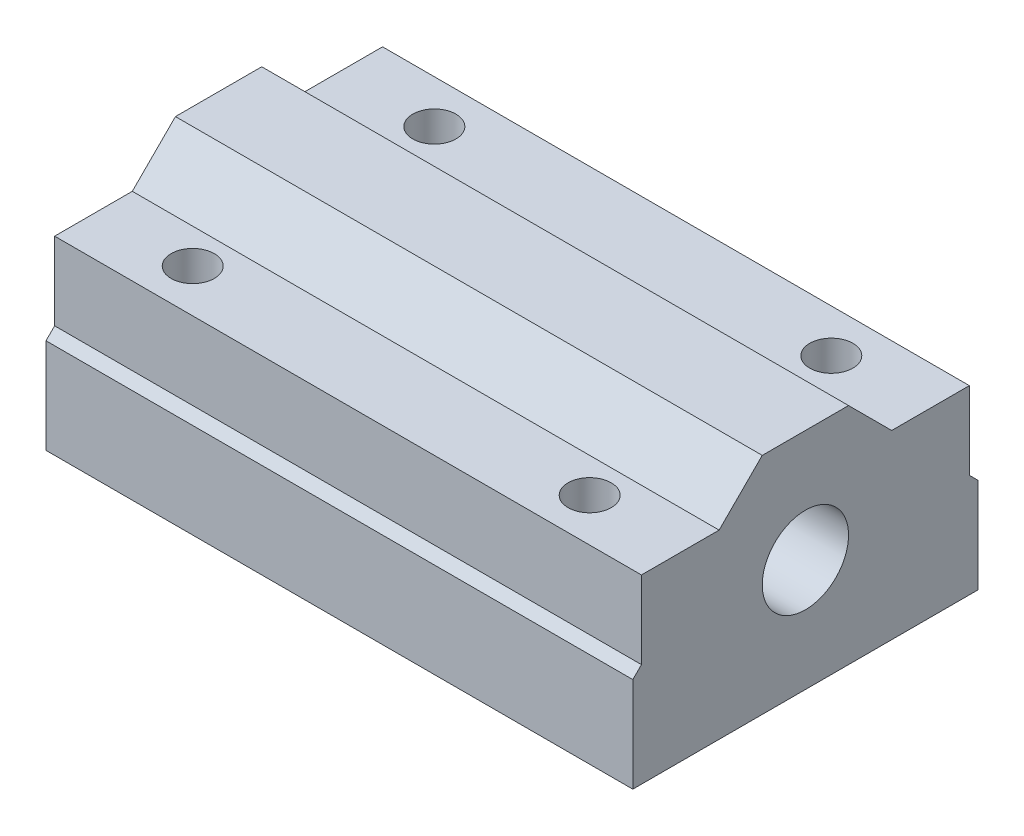
ISO-10303-21;
HEADER;
FILE_DESCRIPTION(('STEP AP214'),'2;1');
FILE_NAME('part.step','',(''),(''),'','','');
FILE_SCHEMA(('AUTOMOTIVE_DESIGN { 1 0 10303 214 1 1 1 1 }'));
ENDSEC;
DATA;
#1=APPLICATION_CONTEXT('core data for automotive mechanical design processes');
#2=APPLICATION_PROTOCOL_DEFINITION('international standard','automotive_design',2000,#1);
#3=PRODUCT_CONTEXT('',#1,'mechanical');
#4=PRODUCT('Part','Part','',(#3));
#5=PRODUCT_RELATED_PRODUCT_CATEGORY('part','',(#4));
#6=PRODUCT_DEFINITION_FORMATION('','',#4);
#7=PRODUCT_DEFINITION_CONTEXT('part definition',#1,'design');
#8=PRODUCT_DEFINITION('design','',#6,#7);
#9=PRODUCT_DEFINITION_SHAPE('','',#8);
#10=(LENGTH_UNIT() NAMED_UNIT(*) SI_UNIT(.MILLI.,.METRE.));
#11=(NAMED_UNIT(*) PLANE_ANGLE_UNIT() SI_UNIT($,.RADIAN.));
#12=(NAMED_UNIT(*) SI_UNIT($,.STERADIAN.) SOLID_ANGLE_UNIT());
#13=UNCERTAINTY_MEASURE_WITH_UNIT(LENGTH_MEASURE(1.E-05),#10,'distance_accuracy_value','');
#14=(GEOMETRIC_REPRESENTATION_CONTEXT(3) GLOBAL_UNCERTAINTY_ASSIGNED_CONTEXT((#13)) GLOBAL_UNIT_ASSIGNED_CONTEXT((#10,
#11,#12)) REPRESENTATION_CONTEXT('',''));
#15=CARTESIAN_POINT('',(0.,0.,0.));
#16=DIRECTION('',(0.,0.,1.));
#17=DIRECTION('',(1.,0.,0.));
#18=AXIS2_PLACEMENT_3D('',#15,#16,#17);
#19=CARTESIAN_POINT('',(0.,26.,-40.));
#20=DIRECTION('',(0.,0.,1.));
#21=DIRECTION('',(1.,0.,0.));
#22=AXIS2_PLACEMENT_3D('',#19,#20,#21);
#23=PLANE('',#22);
#24=DIRECTION('',(0.,-1.,0.));
#25=VECTOR('',#24,1.);
#26=CARTESIAN_POINT('',(0.,26.,-40.));
#27=LINE('',#26,#25);
#28=CARTESIAN_POINT('',(0.,11.,-40.));
#29=VERTEX_POINT('',#28);
#30=CARTESIAN_POINT('',(0.,0.,-40.));
#31=VERTEX_POINT('',#30);
#32=EDGE_CURVE('E199',#29,#31,#27,.T.);
#33=ORIENTED_EDGE('',*,*,#32,.F.);
#34=DIRECTION('',(1.,0.,0.));
#35=VECTOR('',#34,1.);
#36=CARTESIAN_POINT('',(68.,11.,-40.));
#37=LINE('',#36,#35);
#38=CARTESIAN_POINT('',(68.,11.,-40.));
#39=VERTEX_POINT('',#38);
#40=EDGE_CURVE('E239',#29,#39,#37,.T.);
#41=ORIENTED_EDGE('',*,*,#40,.T.);
#42=DIRECTION('',(0.,-1.,0.));
#43=VECTOR('',#42,1.);
#44=CARTESIAN_POINT('',(68.,26.,-40.));
#45=LINE('',#44,#43);
#46=CARTESIAN_POINT('',(68.,0.,-40.));
#47=VERTEX_POINT('',#46);
#48=EDGE_CURVE('E211',#39,#47,#45,.T.);
#49=ORIENTED_EDGE('',*,*,#48,.T.);
#50=DIRECTION('',(-1.,0.,0.));
#51=VECTOR('',#50,1.);
#52=CARTESIAN_POINT('',(0.,0.,-40.));
#53=LINE('',#52,#51);
#54=EDGE_CURVE('E197',#47,#31,#53,.T.);
#55=ORIENTED_EDGE('',*,*,#54,.T.);
#56=EDGE_LOOP('',(#33,#41,#49,#55));
#57=FACE_BOUND('',#56,.T.);
#58=ADVANCED_FACE('F35',(#57),#23,.F.);
#59=CARTESIAN_POINT('',(11.,26.,-34.));
#60=DIRECTION('',(0.,-1.,0.));
#61=DIRECTION('',(0.,0.,-1.));
#62=AXIS2_PLACEMENT_3D('',#59,#60,#61);
#63=CYLINDRICAL_SURFACE('',#62,2.5);
#64=CARTESIAN_POINT('',(11.,0.,-34.));
#65=DIRECTION('',(0.,1.,0.));
#66=DIRECTION('',(0.,0.,1.));
#67=AXIS2_PLACEMENT_3D('',#64,#65,#66);
#68=CIRCLE('',#67,2.5);
#69=CARTESIAN_POINT('',(11.,0.,-36.5));
#70=VERTEX_POINT('',#69);
#71=EDGE_CURVE('E189',#70,#70,#68,.T.);
#72=CARTESIAN_POINT('',(11.,21.,-34.));
#73=DIRECTION('',(0.,1.,0.));
#74=DIRECTION('',(0.,0.,1.));
#75=AXIS2_PLACEMENT_3D('',#72,#73,#74);
#76=CIRCLE('',#75,2.5);
#77=CARTESIAN_POINT('',(11.,21.,-36.5));
#78=VERTEX_POINT('',#77);
#79=EDGE_CURVE('E173',#78,#78,#76,.T.);
#80=CARTESIAN_POINT('',(11.,0.,-36.5));
#81=CARTESIAN_POINT('',(11.,0.21875,-36.5));
#82=CARTESIAN_POINT('',(11.,0.4375,-36.5));
#83=CARTESIAN_POINT('',(11.,0.875000000000001,-36.5));
#84=CARTESIAN_POINT('',(11.,1.09375,-36.5));
#85=CARTESIAN_POINT('',(11.,1.53125,-36.5));
#86=CARTESIAN_POINT('',(11.,1.75,-36.5));
#87=CARTESIAN_POINT('',(11.,2.1875,-36.5));
#88=CARTESIAN_POINT('',(11.,2.40625,-36.5));
#89=CARTESIAN_POINT('',(11.,2.84375,-36.5));
#90=CARTESIAN_POINT('',(11.,3.0625,-36.5));
#91=CARTESIAN_POINT('',(11.,3.5,-36.5));
#92=CARTESIAN_POINT('',(11.,3.71875,-36.5));
#93=CARTESIAN_POINT('',(11.,4.15625,-36.5));
#94=CARTESIAN_POINT('',(11.,4.375,-36.5));
#95=CARTESIAN_POINT('',(11.,4.8125,-36.5));
#96=CARTESIAN_POINT('',(11.,5.03125,-36.5));
#97=CARTESIAN_POINT('',(11.,5.46875,-36.5));
#98=CARTESIAN_POINT('',(11.,5.6875,-36.5));
#99=CARTESIAN_POINT('',(11.,6.125,-36.5));
#100=CARTESIAN_POINT('',(11.,6.34375,-36.5));
#101=CARTESIAN_POINT('',(11.,6.78125,-36.5));
#102=CARTESIAN_POINT('',(11.,7.,-36.5));
#103=CARTESIAN_POINT('',(11.,7.4375,-36.5));
#104=CARTESIAN_POINT('',(11.,7.65625,-36.5));
#105=CARTESIAN_POINT('',(11.,8.09375,-36.5));
#106=CARTESIAN_POINT('',(11.,8.3125,-36.5));
#107=CARTESIAN_POINT('',(11.,8.75,-36.5));
#108=CARTESIAN_POINT('',(11.,8.96875,-36.5));
#109=CARTESIAN_POINT('',(11.,9.40625,-36.5));
#110=CARTESIAN_POINT('',(11.,9.625,-36.5));
#111=CARTESIAN_POINT('',(11.,10.0625,-36.5));
#112=CARTESIAN_POINT('',(11.,10.28125,-36.5));
#113=CARTESIAN_POINT('',(11.,10.71875,-36.5));
#114=CARTESIAN_POINT('',(11.,10.9375,-36.5));
#115=CARTESIAN_POINT('',(11.,11.375,-36.5));
#116=CARTESIAN_POINT('',(11.,11.59375,-36.5));
#117=CARTESIAN_POINT('',(11.,12.03125,-36.5));
#118=CARTESIAN_POINT('',(11.,12.25,-36.5));
#119=CARTESIAN_POINT('',(11.,12.6875,-36.5));
#120=CARTESIAN_POINT('',(11.,12.90625,-36.5));
#121=CARTESIAN_POINT('',(11.,13.34375,-36.5));
#122=CARTESIAN_POINT('',(11.,13.5625,-36.5));
#123=CARTESIAN_POINT('',(11.,14.,-36.5));
#124=CARTESIAN_POINT('',(11.,14.21875,-36.5));
#125=CARTESIAN_POINT('',(11.,14.65625,-36.5));
#126=CARTESIAN_POINT('',(11.,14.875,-36.5));
#127=CARTESIAN_POINT('',(11.,15.3125,-36.5));
#128=CARTESIAN_POINT('',(11.,15.53125,-36.5));
#129=CARTESIAN_POINT('',(11.,15.96875,-36.5));
#130=CARTESIAN_POINT('',(11.,16.1875,-36.5));
#131=CARTESIAN_POINT('',(11.,16.625,-36.5));
#132=CARTESIAN_POINT('',(11.,16.84375,-36.5));
#133=CARTESIAN_POINT('',(11.,17.28125,-36.5));
#134=CARTESIAN_POINT('',(11.,17.5,-36.5));
#135=CARTESIAN_POINT('',(11.,17.9375,-36.5));
#136=CARTESIAN_POINT('',(11.,18.15625,-36.5));
#137=CARTESIAN_POINT('',(11.,18.59375,-36.5));
#138=CARTESIAN_POINT('',(11.,18.8125,-36.5));
#139=CARTESIAN_POINT('',(11.,19.25,-36.5));
#140=CARTESIAN_POINT('',(11.,19.46875,-36.5));
#141=CARTESIAN_POINT('',(11.,19.90625,-36.5));
#142=CARTESIAN_POINT('',(11.,20.125,-36.5));
#143=CARTESIAN_POINT('',(11.,20.5625,-36.5));
#144=CARTESIAN_POINT('',(11.,20.78125,-36.5));
#145=CARTESIAN_POINT('',(11.,21.,-36.5));
#146=B_SPLINE_CURVE_WITH_KNOTS('',3,(#80,#81,#82,#83,#84,#85,#86,#87,#88,#89,#90,#91,#92,#93,
#94,#95,#96,#97,#98,#99,#100,#101,#102,#103,#104,#105,#106,#107,#108,#109,#110,#111,#112,#113,
#114,#115,#116,#117,#118,#119,#120,#121,#122,#123,#124,#125,#126,#127,#128,#129,#130,#131,#132,
#133,#134,#135,#136,#137,#138,#139,#140,#141,#142,#143,#144,#145),.UNSPECIFIED.,.F.,.F.,(4,2,2,
2,2,2,2,2,2,2,2,2,2,2,2,2,2,2,2,2,2,2,2,2,2,2,2,2,2,2,2,2,4),(0.,0.656250000000001,1.3125,
1.96875,2.625,3.28125,3.9375,4.59375,5.25,5.90625,6.5625,7.21875,7.875,8.53125,9.1875,9.84375,
10.5,11.15625,11.8125,12.46875,13.125,13.78125,14.4375,15.09375,15.75,16.40625,17.0625,17.71875,
18.375,19.03125,19.6875,20.34375,21.),.UNSPECIFIED.);
#147=EDGE_CURVE('BSEAM278',#70,#78,#146,.T.);
#148=ORIENTED_EDGE('',*,*,#71,.F.);
#149=ORIENTED_EDGE('',*,*,#79,.T.);
#150=ORIENTED_EDGE('',*,*,#147,.T.);
#151=ORIENTED_EDGE('',*,*,#147,.F.);
#152=EDGE_LOOP('',(#148,#150,#149,#151));
#153=FACE_BOUND('',#152,.T.);
#154=ADVANCED_FACE('F278',(#153),#63,.F.);
#155=CARTESIAN_POINT('',(57.,26.,-34.));
#156=DIRECTION('',(0.,-1.,0.));
#157=DIRECTION('',(0.,0.,-1.));
#158=AXIS2_PLACEMENT_3D('',#155,#156,#157);
#159=CYLINDRICAL_SURFACE('',#158,2.5);
#160=CARTESIAN_POINT('',(57.,0.,-34.));
#161=DIRECTION('',(0.,1.,0.));
#162=DIRECTION('',(0.,0.,1.));
#163=AXIS2_PLACEMENT_3D('',#160,#161,#162);
#164=CIRCLE('',#163,2.5);
#165=CARTESIAN_POINT('',(57.,0.,-36.5));
#166=VERTEX_POINT('',#165);
#167=EDGE_CURVE('E183',#166,#166,#164,.T.);
#168=CARTESIAN_POINT('',(57.,21.,-34.));
#169=DIRECTION('',(0.,1.,0.));
#170=DIRECTION('',(0.,0.,1.));
#171=AXIS2_PLACEMENT_3D('',#168,#169,#170);
#172=CIRCLE('',#171,2.5);
#173=CARTESIAN_POINT('',(57.,21.,-36.5));
#174=VERTEX_POINT('',#173);
#175=EDGE_CURVE('E172',#174,#174,#172,.T.);
#176=CARTESIAN_POINT('',(57.,0.,-36.5));
#177=CARTESIAN_POINT('',(57.,0.21875,-36.5));
#178=CARTESIAN_POINT('',(57.,0.4375,-36.5));
#179=CARTESIAN_POINT('',(57.,0.875000000000001,-36.5));
#180=CARTESIAN_POINT('',(57.,1.09375,-36.5));
#181=CARTESIAN_POINT('',(57.,1.53125,-36.5));
#182=CARTESIAN_POINT('',(57.,1.75,-36.5));
#183=CARTESIAN_POINT('',(57.,2.1875,-36.5));
#184=CARTESIAN_POINT('',(57.,2.40625,-36.5));
#185=CARTESIAN_POINT('',(57.,2.84375,-36.5));
#186=CARTESIAN_POINT('',(57.,3.0625,-36.5));
#187=CARTESIAN_POINT('',(57.,3.5,-36.5));
#188=CARTESIAN_POINT('',(57.,3.71875,-36.5));
#189=CARTESIAN_POINT('',(57.,4.15625,-36.5));
#190=CARTESIAN_POINT('',(57.,4.375,-36.5));
#191=CARTESIAN_POINT('',(57.,4.8125,-36.5));
#192=CARTESIAN_POINT('',(57.,5.03125,-36.5));
#193=CARTESIAN_POINT('',(57.,5.46875,-36.5));
#194=CARTESIAN_POINT('',(57.,5.6875,-36.5));
#195=CARTESIAN_POINT('',(57.,6.125,-36.5));
#196=CARTESIAN_POINT('',(57.,6.34375,-36.5));
#197=CARTESIAN_POINT('',(57.,6.78125,-36.5));
#198=CARTESIAN_POINT('',(57.,7.,-36.5));
#199=CARTESIAN_POINT('',(57.,7.4375,-36.5));
#200=CARTESIAN_POINT('',(57.,7.65625,-36.5));
#201=CARTESIAN_POINT('',(57.,8.09375,-36.5));
#202=CARTESIAN_POINT('',(57.,8.3125,-36.5));
#203=CARTESIAN_POINT('',(57.,8.75,-36.5));
#204=CARTESIAN_POINT('',(57.,8.96875,-36.5));
#205=CARTESIAN_POINT('',(57.,9.40625,-36.5));
#206=CARTESIAN_POINT('',(57.,9.625,-36.5));
#207=CARTESIAN_POINT('',(57.,10.0625,-36.5));
#208=CARTESIAN_POINT('',(57.,10.28125,-36.5));
#209=CARTESIAN_POINT('',(57.,10.71875,-36.5));
#210=CARTESIAN_POINT('',(57.,10.9375,-36.5));
#211=CARTESIAN_POINT('',(57.,11.375,-36.5));
#212=CARTESIAN_POINT('',(57.,11.59375,-36.5));
#213=CARTESIAN_POINT('',(57.,12.03125,-36.5));
#214=CARTESIAN_POINT('',(57.,12.25,-36.5));
#215=CARTESIAN_POINT('',(57.,12.6875,-36.5));
#216=CARTESIAN_POINT('',(57.,12.90625,-36.5));
#217=CARTESIAN_POINT('',(57.,13.34375,-36.5));
#218=CARTESIAN_POINT('',(57.,13.5625,-36.5));
#219=CARTESIAN_POINT('',(57.,14.,-36.5));
#220=CARTESIAN_POINT('',(57.,14.21875,-36.5));
#221=CARTESIAN_POINT('',(57.,14.65625,-36.5));
#222=CARTESIAN_POINT('',(57.,14.875,-36.5));
#223=CARTESIAN_POINT('',(57.,15.3125,-36.5));
#224=CARTESIAN_POINT('',(57.,15.53125,-36.5));
#225=CARTESIAN_POINT('',(57.,15.96875,-36.5));
#226=CARTESIAN_POINT('',(57.,16.1875,-36.5));
#227=CARTESIAN_POINT('',(57.,16.625,-36.5));
#228=CARTESIAN_POINT('',(57.,16.84375,-36.5));
#229=CARTESIAN_POINT('',(57.,17.28125,-36.5));
#230=CARTESIAN_POINT('',(57.,17.5,-36.5));
#231=CARTESIAN_POINT('',(57.,17.9375,-36.5));
#232=CARTESIAN_POINT('',(57.,18.15625,-36.5));
#233=CARTESIAN_POINT('',(57.,18.59375,-36.5));
#234=CARTESIAN_POINT('',(57.,18.8125,-36.5));
#235=CARTESIAN_POINT('',(57.,19.25,-36.5));
#236=CARTESIAN_POINT('',(57.,19.46875,-36.5));
#237=CARTESIAN_POINT('',(57.,19.90625,-36.5));
#238=CARTESIAN_POINT('',(57.,20.125,-36.5));
#239=CARTESIAN_POINT('',(57.,20.5625,-36.5));
#240=CARTESIAN_POINT('',(57.,20.78125,-36.5));
#241=CARTESIAN_POINT('',(57.,21.,-36.5));
#242=B_SPLINE_CURVE_WITH_KNOTS('',3,(#176,#177,#178,#179,#180,#181,#182,#183,#184,#185,#186,
#187,#188,#189,#190,#191,#192,#193,#194,#195,#196,#197,#198,#199,#200,#201,#202,#203,#204,#205,
#206,#207,#208,#209,#210,#211,#212,#213,#214,#215,#216,#217,#218,#219,#220,#221,#222,#223,#224,
#225,#226,#227,#228,#229,#230,#231,#232,#233,#234,#235,#236,#237,#238,#239,#240,#241),
.UNSPECIFIED.,.F.,.F.,(4,2,2,2,2,2,2,2,2,2,2,2,2,2,2,2,2,2,2,2,2,2,2,2,2,2,2,2,2,2,2,2,4),(0.,
0.656250000000001,1.3125,1.96875,2.625,3.28125,3.9375,4.59375,5.25,5.90625,6.5625,7.21875,7.875,
8.53125,9.1875,9.84375,10.5,11.15625,11.8125,12.46875,13.125,13.78125,14.4375,15.09375,15.75,
16.40625,17.0625,17.71875,18.375,19.03125,19.6875,20.34375,21.),.UNSPECIFIED.);
#243=EDGE_CURVE('BSEAM283',#166,#174,#242,.T.);
#244=ORIENTED_EDGE('',*,*,#167,.F.);
#245=ORIENTED_EDGE('',*,*,#175,.T.);
#246=ORIENTED_EDGE('',*,*,#243,.T.);
#247=ORIENTED_EDGE('',*,*,#243,.F.);
#248=EDGE_LOOP('',(#244,#246,#245,#247));
#249=FACE_BOUND('',#248,.T.);
#250=ADVANCED_FACE('F283',(#249),#159,.F.);
#251=CARTESIAN_POINT('',(0.,26.,0.));
#252=DIRECTION('',(0.,-1.,0.));
#253=DIRECTION('',(0.,0.,-1.));
#254=AXIS2_PLACEMENT_3D('',#251,#252,#253);
#255=PLANE('',#254);
#256=DIRECTION('',(0.,0.,1.));
#257=VECTOR('',#256,1.);
#258=CARTESIAN_POINT('',(0.,26.,0.));
#259=LINE('',#258,#257);
#260=CARTESIAN_POINT('',(0.,26.,-25.));
#261=VERTEX_POINT('',#260);
#262=CARTESIAN_POINT('',(0.,26.,-15.));
#263=VERTEX_POINT('',#262);
#264=EDGE_CURVE('E193',#261,#263,#259,.T.);
#265=ORIENTED_EDGE('',*,*,#264,.T.);
#266=DIRECTION('',(1.,0.,0.));
#267=VECTOR('',#266,1.);
#268=CARTESIAN_POINT('',(0.,26.,-15.));
#269=LINE('',#268,#267);
#270=CARTESIAN_POINT('',(68.,26.,-15.));
#271=VERTEX_POINT('',#270);
#272=EDGE_CURVE('E233',#263,#271,#269,.T.);
#273=ORIENTED_EDGE('',*,*,#272,.T.);
#274=DIRECTION('',(0.,0.,-1.));
#275=VECTOR('',#274,1.);
#276=CARTESIAN_POINT('',(68.,26.,0.));
#277=LINE('',#276,#275);
#278=CARTESIAN_POINT('',(68.,26.,-25.));
#279=VERTEX_POINT('',#278);
#280=EDGE_CURVE('E196',#271,#279,#277,.T.);
#281=ORIENTED_EDGE('',*,*,#280,.T.);
#282=DIRECTION('',(-1.,0.,0.));
#283=VECTOR('',#282,1.);
#284=CARTESIAN_POINT('',(0.,26.,-25.));
#285=LINE('',#284,#283);
#286=EDGE_CURVE('E226',#279,#261,#285,.T.);
#287=ORIENTED_EDGE('',*,*,#286,.T.);
#288=EDGE_LOOP('',(#265,#273,#281,#287));
#289=FACE_BOUND('',#288,.T.);
#290=ADVANCED_FACE('F289',(#289),#255,.F.);
#291=CARTESIAN_POINT('',(0.,0.,0.));
#292=DIRECTION('',(0.,-1.,0.));
#293=DIRECTION('',(0.,0.,-1.));
#294=AXIS2_PLACEMENT_3D('',#291,#292,#293);
#295=PLANE('',#294);
#296=ORIENTED_EDGE('',*,*,#167,.T.);
#297=EDGE_LOOP('',(#296));
#298=FACE_BOUND('',#297,.T.);
#299=ORIENTED_EDGE('',*,*,#71,.T.);
#300=EDGE_LOOP('',(#299));
#301=FACE_BOUND('',#300,.T.);
#302=DIRECTION('',(0.,0.,1.));
#303=VECTOR('',#302,1.);
#304=CARTESIAN_POINT('',(0.,0.,0.));
#305=LINE('',#304,#303);
#306=CARTESIAN_POINT('',(0.,0.,0.));
#307=VERTEX_POINT('',#306);
#308=EDGE_CURVE('E192',#31,#307,#305,.T.);
#309=ORIENTED_EDGE('',*,*,#308,.F.);
#310=ORIENTED_EDGE('',*,*,#54,.F.);
#311=DIRECTION('',(0.,0.,-1.));
#312=VECTOR('',#311,1.);
#313=CARTESIAN_POINT('',(68.,0.,0.));
#314=LINE('',#313,#312);
#315=CARTESIAN_POINT('',(68.,0.,0.));
#316=VERTEX_POINT('',#315);
#317=EDGE_CURVE('E205',#316,#47,#314,.T.);
#318=ORIENTED_EDGE('',*,*,#317,.F.);
#319=DIRECTION('',(1.,0.,0.));
#320=VECTOR('',#319,1.);
#321=CARTESIAN_POINT('',(0.,0.,0.));
#322=LINE('',#321,#320);
#323=EDGE_CURVE('E202',#307,#316,#322,.T.);
#324=ORIENTED_EDGE('',*,*,#323,.F.);
#325=EDGE_LOOP('',(#309,#310,#318,#324));
#326=FACE_BOUND('',#325,.T.);
#327=CARTESIAN_POINT('',(11.,0.,-6.));
#328=DIRECTION('',(0.,1.,0.));
#329=DIRECTION('',(0.,0.,1.));
#330=AXIS2_PLACEMENT_3D('',#327,#328,#329);
#331=CIRCLE('',#330,2.5);
#332=CARTESIAN_POINT('',(11.,0.,-8.5));
#333=VERTEX_POINT('',#332);
#334=EDGE_CURVE('E186',#333,#333,#331,.T.);
#335=ORIENTED_EDGE('',*,*,#334,.T.);
#336=EDGE_LOOP('',(#335));
#337=FACE_BOUND('',#336,.T.);
#338=CARTESIAN_POINT('',(57.,0.,-6.));
#339=DIRECTION('',(0.,1.,0.));
#340=DIRECTION('',(0.,0.,1.));
#341=AXIS2_PLACEMENT_3D('',#338,#339,#340);
#342=CIRCLE('',#341,2.5);
#343=CARTESIAN_POINT('',(57.,0.,-8.5));
#344=VERTEX_POINT('',#343);
#345=EDGE_CURVE('E180',#344,#344,#342,.T.);
#346=ORIENTED_EDGE('',*,*,#345,.T.);
#347=EDGE_LOOP('',(#346));
#348=FACE_BOUND('',#347,.T.);
#349=ADVANCED_FACE('F263',(#298,#301,#326,#337,#348),#295,.T.);
#350=CARTESIAN_POINT('',(0.,26.,0.));
#351=DIRECTION('',(1.,0.,0.));
#352=DIRECTION('',(0.,0.,-1.));
#353=AXIS2_PLACEMENT_3D('',#350,#351,#352);
#354=PLANE('',#353);
#355=CARTESIAN_POINT('',(0.,13.,-20.));
#356=DIRECTION('',(-1.,0.,0.));
#357=DIRECTION('',(0.,0.,1.));
#358=AXIS2_PLACEMENT_3D('',#355,#356,#357);
#359=CIRCLE('',#358,5.);
#360=CARTESIAN_POINT('',(0.,13.,-15.));
#361=VERTEX_POINT('',#360);
#362=EDGE_CURVE('E176',#361,#361,#359,.T.);
#363=ORIENTED_EDGE('',*,*,#362,.F.);
#364=EDGE_LOOP('',(#363));
#365=FACE_BOUND('',#364,.T.);
#366=DIRECTION('',(0.,-1.,0.));
#367=VECTOR('',#366,1.);
#368=CARTESIAN_POINT('',(0.,26.,0.));
#369=LINE('',#368,#367);
#370=CARTESIAN_POINT('',(0.,11.,0.));
#371=VERTEX_POINT('',#370);
#372=EDGE_CURVE('E215',#371,#307,#369,.T.);
#373=ORIENTED_EDGE('',*,*,#372,.F.);
#374=DIRECTION('',(0.,-0.707106781186548,0.707106781186547));
#375=VECTOR('',#374,1.);
#376=CARTESIAN_POINT('',(0.,12.,-1.00000000000001));
#377=LINE('',#376,#375);
#378=CARTESIAN_POINT('',(0.,12.,-1.));
#379=VERTEX_POINT('',#378);
#380=EDGE_CURVE('E11',#371,#379,#377,.F.);
#381=ORIENTED_EDGE('',*,*,#380,.T.);
#382=DIRECTION('',(0.,1.,0.));
#383=VECTOR('',#382,1.);
#384=CARTESIAN_POINT('',(0.,12.,-1.));
#385=LINE('',#384,#383);
#386=CARTESIAN_POINT('',(0.,21.,-1.));
#387=VERTEX_POINT('',#386);
#388=EDGE_CURVE('E132',#379,#387,#385,.T.);
#389=ORIENTED_EDGE('',*,*,#388,.T.);
#390=DIRECTION('',(0.,0.,1.));
#391=VECTOR('',#390,1.);
#392=CARTESIAN_POINT('',(0.,21.,0.));
#393=LINE('',#392,#391);
#394=CARTESIAN_POINT('',(0.,21.,-10.));
#395=VERTEX_POINT('',#394);
#396=EDGE_CURVE('E152',#395,#387,#393,.T.);
#397=ORIENTED_EDGE('',*,*,#396,.F.);
#398=DIRECTION('',(0.,-0.707106781186546,0.707106781186549));
#399=VECTOR('',#398,1.);
#400=CARTESIAN_POINT('',(0.,21.,-10.));
#401=LINE('',#400,#399);
#402=EDGE_CURVE('E231',#395,#263,#401,.F.);
#403=ORIENTED_EDGE('',*,*,#402,.T.);
#404=ORIENTED_EDGE('',*,*,#264,.F.);
#405=DIRECTION('',(0.,0.707106781186546,0.707106781186549));
#406=VECTOR('',#405,1.);
#407=CARTESIAN_POINT('',(0.,21.,-30.));
#408=LINE('',#407,#406);
#409=CARTESIAN_POINT('',(0.,21.,-30.));
#410=VERTEX_POINT('',#409);
#411=EDGE_CURVE('E228',#261,#410,#408,.F.);
#412=ORIENTED_EDGE('',*,*,#411,.T.);
#413=DIRECTION('',(0.,0.,1.));
#414=VECTOR('',#413,1.);
#415=CARTESIAN_POINT('',(0.,21.,-40.));
#416=LINE('',#415,#414);
#417=CARTESIAN_POINT('',(0.,21.,-39.));
#418=VERTEX_POINT('',#417);
#419=EDGE_CURVE('E164',#418,#410,#416,.T.);
#420=ORIENTED_EDGE('',*,*,#419,.F.);
#421=DIRECTION('',(0.,1.,0.));
#422=VECTOR('',#421,1.);
#423=CARTESIAN_POINT('',(0.,12.,-39.));
#424=LINE('',#423,#422);
#425=CARTESIAN_POINT('',(0.,12.,-39.));
#426=VERTEX_POINT('',#425);
#427=EDGE_CURVE('E147',#426,#418,#424,.T.);
#428=ORIENTED_EDGE('',*,*,#427,.F.);
#429=DIRECTION('',(0.,-0.707106781186553,-0.707106781186543));
#430=VECTOR('',#429,1.);
#431=CARTESIAN_POINT('',(0.,12.,-39.));
#432=LINE('',#431,#430);
#433=EDGE_CURVE('E237',#426,#29,#432,.T.);
#434=ORIENTED_EDGE('',*,*,#433,.T.);
#435=ORIENTED_EDGE('',*,*,#32,.T.);
#436=ORIENTED_EDGE('',*,*,#308,.T.);
#437=EDGE_LOOP('',(#373,#381,#389,#397,#403,#404,#412,#420,#428,#434,#435,#436));
#438=FACE_BOUND('',#437,.T.);
#439=ADVANCED_FACE('F255',(#365,#438),#354,.F.);
#440=CARTESIAN_POINT('',(0.,26.,0.));
#441=DIRECTION('',(0.,0.,-1.));
#442=DIRECTION('',(-1.,0.,0.));
#443=AXIS2_PLACEMENT_3D('',#440,#441,#442);
#444=PLANE('',#443);
#445=DIRECTION('',(0.,-1.,0.));
#446=VECTOR('',#445,1.);
#447=CARTESIAN_POINT('',(68.,26.,0.));
#448=LINE('',#447,#446);
#449=CARTESIAN_POINT('',(68.,11.,0.));
#450=VERTEX_POINT('',#449);
#451=EDGE_CURVE('E213',#450,#316,#448,.T.);
#452=ORIENTED_EDGE('',*,*,#451,.F.);
#453=DIRECTION('',(-1.,0.,0.));
#454=VECTOR('',#453,1.);
#455=CARTESIAN_POINT('',(0.,11.,0.));
#456=LINE('',#455,#454);
#457=EDGE_CURVE('E43',#450,#371,#456,.T.);
#458=ORIENTED_EDGE('',*,*,#457,.T.);
#459=ORIENTED_EDGE('',*,*,#372,.T.);
#460=ORIENTED_EDGE('',*,*,#323,.T.);
#461=EDGE_LOOP('',(#452,#458,#459,#460));
#462=FACE_BOUND('',#461,.T.);
#463=ADVANCED_FACE('F265',(#462),#444,.F.);
#464=CARTESIAN_POINT('',(68.,26.,0.));
#465=DIRECTION('',(-1.,0.,0.));
#466=DIRECTION('',(0.,0.,1.));
#467=AXIS2_PLACEMENT_3D('',#464,#465,#466);
#468=PLANE('',#467);
#469=CARTESIAN_POINT('',(68.,13.,-20.));
#470=DIRECTION('',(-1.,0.,0.));
#471=DIRECTION('',(0.,0.,1.));
#472=AXIS2_PLACEMENT_3D('',#469,#470,#471);
#473=CIRCLE('',#472,5.);
#474=CARTESIAN_POINT('',(68.,13.,-15.));
#475=VERTEX_POINT('',#474);
#476=EDGE_CURVE('E179',#475,#475,#473,.T.);
#477=ORIENTED_EDGE('',*,*,#476,.T.);
#478=EDGE_LOOP('',(#477));
#479=FACE_BOUND('',#478,.T.);
#480=DIRECTION('',(0.,1.,0.));
#481=VECTOR('',#480,1.);
#482=CARTESIAN_POINT('',(68.,12.,-1.));
#483=LINE('',#482,#481);
#484=CARTESIAN_POINT('',(68.,12.,-1.));
#485=VERTEX_POINT('',#484);
#486=CARTESIAN_POINT('',(68.,21.,-1.));
#487=VERTEX_POINT('',#486);
#488=EDGE_CURVE('E129',#485,#487,#483,.T.);
#489=ORIENTED_EDGE('',*,*,#488,.F.);
#490=DIRECTION('',(0.,0.707106781186548,-0.707106781186547));
#491=VECTOR('',#490,1.);
#492=CARTESIAN_POINT('',(68.,12.,-1.00000000000001));
#493=LINE('',#492,#491);
#494=EDGE_CURVE('E57',#485,#450,#493,.F.);
#495=ORIENTED_EDGE('',*,*,#494,.T.);
#496=ORIENTED_EDGE('',*,*,#451,.T.);
#497=ORIENTED_EDGE('',*,*,#317,.T.);
#498=ORIENTED_EDGE('',*,*,#48,.F.);
#499=DIRECTION('',(0.,0.707106781186553,0.707106781186543));
#500=VECTOR('',#499,1.);
#501=CARTESIAN_POINT('',(68.,12.,-39.));
#502=LINE('',#501,#500);
#503=CARTESIAN_POINT('',(68.,12.,-39.));
#504=VERTEX_POINT('',#503);
#505=EDGE_CURVE('E124',#39,#504,#502,.T.);
#506=ORIENTED_EDGE('',*,*,#505,.T.);
#507=DIRECTION('',(0.,1.,0.));
#508=VECTOR('',#507,1.);
#509=CARTESIAN_POINT('',(68.,12.,-39.));
#510=LINE('',#509,#508);
#511=CARTESIAN_POINT('',(68.,21.,-39.));
#512=VERTEX_POINT('',#511);
#513=EDGE_CURVE('E149',#504,#512,#510,.T.);
#514=ORIENTED_EDGE('',*,*,#513,.T.);
#515=DIRECTION('',(0.,0.,-1.));
#516=VECTOR('',#515,1.);
#517=CARTESIAN_POINT('',(68.,21.,-40.));
#518=LINE('',#517,#516);
#519=CARTESIAN_POINT('',(68.,21.,-30.));
#520=VERTEX_POINT('',#519);
#521=EDGE_CURVE('E169',#520,#512,#518,.T.);
#522=ORIENTED_EDGE('',*,*,#521,.F.);
#523=DIRECTION('',(0.,-0.707106781186546,-0.707106781186549));
#524=VECTOR('',#523,1.);
#525=CARTESIAN_POINT('',(68.,21.,-30.));
#526=LINE('',#525,#524);
#527=EDGE_CURVE('E217',#520,#279,#526,.F.);
#528=ORIENTED_EDGE('',*,*,#527,.T.);
#529=ORIENTED_EDGE('',*,*,#280,.F.);
#530=DIRECTION('',(0.,0.707106781186546,-0.707106781186549));
#531=VECTOR('',#530,1.);
#532=CARTESIAN_POINT('',(68.,21.,-10.));
#533=LINE('',#532,#531);
#534=CARTESIAN_POINT('',(68.,21.,-10.));
#535=VERTEX_POINT('',#534);
#536=EDGE_CURVE('E235',#271,#535,#533,.F.);
#537=ORIENTED_EDGE('',*,*,#536,.T.);
#538=DIRECTION('',(0.,0.,-1.));
#539=VECTOR('',#538,1.);
#540=CARTESIAN_POINT('',(68.,21.,0.));
#541=LINE('',#540,#539);
#542=EDGE_CURVE('E138',#487,#535,#541,.T.);
#543=ORIENTED_EDGE('',*,*,#542,.F.);
#544=EDGE_LOOP('',(#489,#495,#496,#497,#498,#506,#514,#522,#528,#529,#537,#543));
#545=FACE_BOUND('',#544,.T.);
#546=ADVANCED_FACE('F136',(#479,#545),#468,.F.);
#547=CARTESIAN_POINT('',(11.,26.,-6.));
#548=DIRECTION('',(0.,-1.,0.));
#549=DIRECTION('',(0.,0.,-1.));
#550=AXIS2_PLACEMENT_3D('',#547,#548,#549);
#551=CYLINDRICAL_SURFACE('',#550,2.5);
#552=CARTESIAN_POINT('',(11.,21.,-6.));
#553=DIRECTION('',(0.,-1.,0.));
#554=DIRECTION('',(0.,0.,-1.));
#555=AXIS2_PLACEMENT_3D('',#552,#553,#554);
#556=CIRCLE('',#555,2.5);
#557=CARTESIAN_POINT('',(11.,21.,-8.5));
#558=VERTEX_POINT('',#557);
#559=EDGE_CURVE('E161',#558,#558,#556,.T.);
#560=CARTESIAN_POINT('',(11.,21.,-8.5));
#561=CARTESIAN_POINT('',(11.,20.78125,-8.5));
#562=CARTESIAN_POINT('',(11.,20.5625,-8.5));
#563=CARTESIAN_POINT('',(11.,20.125,-8.5));
#564=CARTESIAN_POINT('',(11.,19.90625,-8.5));
#565=CARTESIAN_POINT('',(11.,19.46875,-8.5));
#566=CARTESIAN_POINT('',(11.,19.25,-8.5));
#567=CARTESIAN_POINT('',(11.,18.8125,-8.5));
#568=CARTESIAN_POINT('',(11.,18.59375,-8.5));
#569=CARTESIAN_POINT('',(11.,18.15625,-8.5));
#570=CARTESIAN_POINT('',(11.,17.9375,-8.5));
#571=CARTESIAN_POINT('',(11.,17.5,-8.5));
#572=CARTESIAN_POINT('',(11.,17.28125,-8.5));
#573=CARTESIAN_POINT('',(11.,16.84375,-8.5));
#574=CARTESIAN_POINT('',(11.,16.625,-8.5));
#575=CARTESIAN_POINT('',(11.,16.1875,-8.5));
#576=CARTESIAN_POINT('',(11.,15.96875,-8.5));
#577=CARTESIAN_POINT('',(11.,15.53125,-8.5));
#578=CARTESIAN_POINT('',(11.,15.3125,-8.5));
#579=CARTESIAN_POINT('',(11.,14.875,-8.5));
#580=CARTESIAN_POINT('',(11.,14.65625,-8.5));
#581=CARTESIAN_POINT('',(11.,14.21875,-8.5));
#582=CARTESIAN_POINT('',(11.,14.,-8.5));
#583=CARTESIAN_POINT('',(11.,13.5625,-8.5));
#584=CARTESIAN_POINT('',(11.,13.34375,-8.5));
#585=CARTESIAN_POINT('',(11.,12.90625,-8.5));
#586=CARTESIAN_POINT('',(11.,12.6875,-8.5));
#587=CARTESIAN_POINT('',(11.,12.25,-8.5));
#588=CARTESIAN_POINT('',(11.,12.03125,-8.5));
#589=CARTESIAN_POINT('',(11.,11.59375,-8.5));
#590=CARTESIAN_POINT('',(11.,11.375,-8.5));
#591=CARTESIAN_POINT('',(11.,10.9375,-8.5));
#592=CARTESIAN_POINT('',(11.,10.71875,-8.5));
#593=CARTESIAN_POINT('',(11.,10.28125,-8.5));
#594=CARTESIAN_POINT('',(11.,10.0625,-8.5));
#595=CARTESIAN_POINT('',(11.,9.625,-8.5));
#596=CARTESIAN_POINT('',(11.,9.40625,-8.5));
#597=CARTESIAN_POINT('',(11.,8.96875,-8.5));
#598=CARTESIAN_POINT('',(11.,8.75,-8.5));
#599=CARTESIAN_POINT('',(11.,8.3125,-8.5));
#600=CARTESIAN_POINT('',(11.,8.09375,-8.5));
#601=CARTESIAN_POINT('',(11.,7.65625,-8.5));
#602=CARTESIAN_POINT('',(11.,7.4375,-8.5));
#603=CARTESIAN_POINT('',(11.,7.,-8.5));
#604=CARTESIAN_POINT('',(11.,6.78125,-8.5));
#605=CARTESIAN_POINT('',(11.,6.34375,-8.5));
#606=CARTESIAN_POINT('',(11.,6.125,-8.5));
#607=CARTESIAN_POINT('',(11.,5.6875,-8.5));
#608=CARTESIAN_POINT('',(11.,5.46875,-8.5));
#609=CARTESIAN_POINT('',(11.,5.03125,-8.5));
#610=CARTESIAN_POINT('',(11.,4.8125,-8.5));
#611=CARTESIAN_POINT('',(11.,4.375,-8.5));
#612=CARTESIAN_POINT('',(11.,4.15625,-8.5));
#613=CARTESIAN_POINT('',(11.,3.71875,-8.5));
#614=CARTESIAN_POINT('',(11.,3.5,-8.5));
#615=CARTESIAN_POINT('',(11.,3.0625,-8.5));
#616=CARTESIAN_POINT('',(11.,2.84375,-8.5));
#617=CARTESIAN_POINT('',(11.,2.40625,-8.5));
#618=CARTESIAN_POINT('',(11.,2.1875,-8.5));
#619=CARTESIAN_POINT('',(11.,1.75,-8.5));
#620=CARTESIAN_POINT('',(11.,1.53125,-8.5));
#621=CARTESIAN_POINT('',(11.,1.09375,-8.5));
#622=CARTESIAN_POINT('',(11.,0.874999999999998,-8.5));
#623=CARTESIAN_POINT('',(11.,0.437499999999998,-8.5));
#624=CARTESIAN_POINT('',(11.,0.218749999999999,-8.5));
#625=CARTESIAN_POINT('',(11.,0.,-8.5));
#626=B_SPLINE_CURVE_WITH_KNOTS('',3,(#560,#561,#562,#563,#564,#565,#566,#567,#568,#569,#570,
#571,#572,#573,#574,#575,#576,#577,#578,#579,#580,#581,#582,#583,#584,#585,#586,#587,#588,#589,
#590,#591,#592,#593,#594,#595,#596,#597,#598,#599,#600,#601,#602,#603,#604,#605,#606,#607,#608,
#609,#610,#611,#612,#613,#614,#615,#616,#617,#618,#619,#620,#621,#622,#623,#624,#625),
.UNSPECIFIED.,.F.,.F.,(4,2,2,2,2,2,2,2,2,2,2,2,2,2,2,2,2,2,2,2,2,2,2,2,2,2,2,2,2,2,2,2,4),(0.,
0.656250000000001,1.3125,1.96875,2.625,3.28125,3.9375,4.59375,5.25,5.90625,6.5625,7.21875,7.875,
8.53125,9.1875,9.84375,10.5,11.15625,11.8125,12.46875,13.125,13.78125,14.4375,15.09375,15.75,
16.40625,17.0625,17.71875,18.375,19.03125,19.6875,20.34375,21.),.UNSPECIFIED.);
#627=EDGE_CURVE('BSEAM272',#558,#333,#626,.T.);
#628=ORIENTED_EDGE('',*,*,#559,.F.);
#629=ORIENTED_EDGE('',*,*,#334,.F.);
#630=ORIENTED_EDGE('',*,*,#627,.T.);
#631=ORIENTED_EDGE('',*,*,#627,.F.);
#632=EDGE_LOOP('',(#628,#630,#629,#631));
#633=FACE_BOUND('',#632,.T.);
#634=ADVANCED_FACE('F272',(#633),#551,.F.);
#635=CARTESIAN_POINT('',(57.,26.,-6.));
#636=DIRECTION('',(0.,-1.,0.));
#637=DIRECTION('',(0.,0.,-1.));
#638=AXIS2_PLACEMENT_3D('',#635,#636,#637);
#639=CYLINDRICAL_SURFACE('',#638,2.5);
#640=CARTESIAN_POINT('',(57.,21.,-6.));
#641=DIRECTION('',(0.,-1.,0.));
#642=DIRECTION('',(0.,0.,-1.));
#643=AXIS2_PLACEMENT_3D('',#640,#641,#642);
#644=CIRCLE('',#643,2.5);
#645=CARTESIAN_POINT('',(57.,21.,-8.5));
#646=VERTEX_POINT('',#645);
#647=EDGE_CURVE('E160',#646,#646,#644,.T.);
#648=CARTESIAN_POINT('',(57.,21.,-8.5));
#649=CARTESIAN_POINT('',(57.,20.78125,-8.5));
#650=CARTESIAN_POINT('',(57.,20.5625,-8.5));
#651=CARTESIAN_POINT('',(57.,20.125,-8.5));
#652=CARTESIAN_POINT('',(57.,19.90625,-8.5));
#653=CARTESIAN_POINT('',(57.,19.46875,-8.5));
#654=CARTESIAN_POINT('',(57.,19.25,-8.5));
#655=CARTESIAN_POINT('',(57.,18.8125,-8.5));
#656=CARTESIAN_POINT('',(57.,18.59375,-8.5));
#657=CARTESIAN_POINT('',(57.,18.15625,-8.5));
#658=CARTESIAN_POINT('',(57.,17.9375,-8.5));
#659=CARTESIAN_POINT('',(57.,17.5,-8.5));
#660=CARTESIAN_POINT('',(57.,17.28125,-8.5));
#661=CARTESIAN_POINT('',(57.,16.84375,-8.5));
#662=CARTESIAN_POINT('',(57.,16.625,-8.5));
#663=CARTESIAN_POINT('',(57.,16.1875,-8.5));
#664=CARTESIAN_POINT('',(57.,15.96875,-8.5));
#665=CARTESIAN_POINT('',(57.,15.53125,-8.5));
#666=CARTESIAN_POINT('',(57.,15.3125,-8.5));
#667=CARTESIAN_POINT('',(57.,14.875,-8.5));
#668=CARTESIAN_POINT('',(57.,14.65625,-8.5));
#669=CARTESIAN_POINT('',(57.,14.21875,-8.5));
#670=CARTESIAN_POINT('',(57.,14.,-8.5));
#671=CARTESIAN_POINT('',(57.,13.5625,-8.5));
#672=CARTESIAN_POINT('',(57.,13.34375,-8.5));
#673=CARTESIAN_POINT('',(57.,12.90625,-8.5));
#674=CARTESIAN_POINT('',(57.,12.6875,-8.5));
#675=CARTESIAN_POINT('',(57.,12.25,-8.5));
#676=CARTESIAN_POINT('',(57.,12.03125,-8.5));
#677=CARTESIAN_POINT('',(57.,11.59375,-8.5));
#678=CARTESIAN_POINT('',(57.,11.375,-8.5));
#679=CARTESIAN_POINT('',(57.,10.9375,-8.5));
#680=CARTESIAN_POINT('',(57.,10.71875,-8.5));
#681=CARTESIAN_POINT('',(57.,10.28125,-8.5));
#682=CARTESIAN_POINT('',(57.,10.0625,-8.5));
#683=CARTESIAN_POINT('',(57.,9.625,-8.5));
#684=CARTESIAN_POINT('',(57.,9.40625,-8.5));
#685=CARTESIAN_POINT('',(57.,8.96875,-8.5));
#686=CARTESIAN_POINT('',(57.,8.75,-8.5));
#687=CARTESIAN_POINT('',(57.,8.3125,-8.5));
#688=CARTESIAN_POINT('',(57.,8.09375,-8.5));
#689=CARTESIAN_POINT('',(57.,7.65625,-8.5));
#690=CARTESIAN_POINT('',(57.,7.4375,-8.5));
#691=CARTESIAN_POINT('',(57.,7.,-8.5));
#692=CARTESIAN_POINT('',(57.,6.78125,-8.5));
#693=CARTESIAN_POINT('',(57.,6.34375,-8.5));
#694=CARTESIAN_POINT('',(57.,6.125,-8.5));
#695=CARTESIAN_POINT('',(57.,5.6875,-8.5));
#696=CARTESIAN_POINT('',(57.,5.46875,-8.5));
#697=CARTESIAN_POINT('',(57.,5.03125,-8.5));
#698=CARTESIAN_POINT('',(57.,4.8125,-8.5));
#699=CARTESIAN_POINT('',(57.,4.375,-8.5));
#700=CARTESIAN_POINT('',(57.,4.15625,-8.5));
#701=CARTESIAN_POINT('',(57.,3.71875,-8.5));
#702=CARTESIAN_POINT('',(57.,3.5,-8.5));
#703=CARTESIAN_POINT('',(57.,3.0625,-8.5));
#704=CARTESIAN_POINT('',(57.,2.84375,-8.5));
#705=CARTESIAN_POINT('',(57.,2.40625,-8.5));
#706=CARTESIAN_POINT('',(57.,2.1875,-8.5));
#707=CARTESIAN_POINT('',(57.,1.75,-8.5));
#708=CARTESIAN_POINT('',(57.,1.53125,-8.5));
#709=CARTESIAN_POINT('',(57.,1.09375,-8.5));
#710=CARTESIAN_POINT('',(57.,0.874999999999998,-8.5));
#711=CARTESIAN_POINT('',(57.,0.437499999999998,-8.5));
#712=CARTESIAN_POINT('',(57.,0.218749999999999,-8.5));
#713=CARTESIAN_POINT('',(57.,0.,-8.5));
#714=B_SPLINE_CURVE_WITH_KNOTS('',3,(#648,#649,#650,#651,#652,#653,#654,#655,#656,#657,#658,
#659,#660,#661,#662,#663,#664,#665,#666,#667,#668,#669,#670,#671,#672,#673,#674,#675,#676,#677,
#678,#679,#680,#681,#682,#683,#684,#685,#686,#687,#688,#689,#690,#691,#692,#693,#694,#695,#696,
#697,#698,#699,#700,#701,#702,#703,#704,#705,#706,#707,#708,#709,#710,#711,#712,#713),
.UNSPECIFIED.,.F.,.F.,(4,2,2,2,2,2,2,2,2,2,2,2,2,2,2,2,2,2,2,2,2,2,2,2,2,2,2,2,2,2,2,2,4),(0.,
0.656250000000001,1.3125,1.96875,2.625,3.28125,3.9375,4.59375,5.25,5.90625,6.5625,7.21875,7.875,
8.53125,9.1875,9.84375,10.5,11.15625,11.8125,12.46875,13.125,13.78125,14.4375,15.09375,15.75,
16.40625,17.0625,17.71875,18.375,19.03125,19.6875,20.34375,21.),.UNSPECIFIED.);
#715=EDGE_CURVE('BSEAM296',#646,#344,#714,.T.);
#716=ORIENTED_EDGE('',*,*,#647,.F.);
#717=ORIENTED_EDGE('',*,*,#345,.F.);
#718=ORIENTED_EDGE('',*,*,#715,.T.);
#719=ORIENTED_EDGE('',*,*,#715,.F.);
#720=EDGE_LOOP('',(#716,#718,#717,#719));
#721=FACE_BOUND('',#720,.T.);
#722=ADVANCED_FACE('F296',(#721),#639,.F.);
#723=CARTESIAN_POINT('',(76.,13.,-20.));
#724=DIRECTION('',(-1.,0.,0.));
#725=DIRECTION('',(0.,0.,1.));
#726=AXIS2_PLACEMENT_3D('',#723,#724,#725);
#727=CYLINDRICAL_SURFACE('',#726,5.);
#728=ORIENTED_EDGE('',*,*,#362,.T.);
#729=EDGE_LOOP('',(#728));
#730=FACE_BOUND('',#729,.T.);
#731=ORIENTED_EDGE('',*,*,#476,.F.);
#732=EDGE_LOOP('',(#731));
#733=FACE_BOUND('',#732,.T.);
#734=ADVANCED_FACE('F303',(#730,#733),#727,.F.);
#735=CARTESIAN_POINT('',(0.,21.,0.));
#736=DIRECTION('',(0.,1.,0.));
#737=DIRECTION('',(0.,0.,1.));
#738=AXIS2_PLACEMENT_3D('',#735,#736,#737);
#739=PLANE('',#738);
#740=DIRECTION('',(1.,0.,0.));
#741=VECTOR('',#740,1.);
#742=CARTESIAN_POINT('',(0.,21.,-39.));
#743=LINE('',#742,#741);
#744=EDGE_CURVE('E140',#418,#512,#743,.T.);
#745=ORIENTED_EDGE('',*,*,#744,.F.);
#746=ORIENTED_EDGE('',*,*,#419,.T.);
#747=DIRECTION('',(1.,0.,0.));
#748=VECTOR('',#747,1.);
#749=CARTESIAN_POINT('',(0.,21.,-30.));
#750=LINE('',#749,#748);
#751=EDGE_CURVE('E166',#410,#520,#750,.T.);
#752=ORIENTED_EDGE('',*,*,#751,.T.);
#753=ORIENTED_EDGE('',*,*,#521,.T.);
#754=EDGE_LOOP('',(#745,#746,#752,#753));
#755=FACE_BOUND('',#754,.T.);
#756=ORIENTED_EDGE('',*,*,#79,.F.);
#757=EDGE_LOOP('',(#756));
#758=FACE_BOUND('',#757,.T.);
#759=ORIENTED_EDGE('',*,*,#175,.F.);
#760=EDGE_LOOP('',(#759));
#761=FACE_BOUND('',#760,.T.);
#762=ADVANCED_FACE('F307',(#755,#758,#761),#739,.T.);
#763=CARTESIAN_POINT('',(0.,21.,0.));
#764=DIRECTION('',(0.,-1.,0.));
#765=DIRECTION('',(0.,0.,-1.));
#766=AXIS2_PLACEMENT_3D('',#763,#764,#765);
#767=PLANE('',#766);
#768=ORIENTED_EDGE('',*,*,#559,.T.);
#769=EDGE_LOOP('',(#768));
#770=FACE_BOUND('',#769,.T.);
#771=ORIENTED_EDGE('',*,*,#647,.T.);
#772=EDGE_LOOP('',(#771));
#773=FACE_BOUND('',#772,.T.);
#774=ORIENTED_EDGE('',*,*,#396,.T.);
#775=DIRECTION('',(-1.,0.,0.));
#776=VECTOR('',#775,1.);
#777=CARTESIAN_POINT('',(0.,21.,-1.));
#778=LINE('',#777,#776);
#779=EDGE_CURVE('E133',#487,#387,#778,.T.);
#780=ORIENTED_EDGE('',*,*,#779,.F.);
#781=ORIENTED_EDGE('',*,*,#542,.T.);
#782=DIRECTION('',(-1.,0.,0.));
#783=VECTOR('',#782,1.);
#784=CARTESIAN_POINT('',(0.,21.,-10.));
#785=LINE('',#784,#783);
#786=EDGE_CURVE('E157',#535,#395,#785,.T.);
#787=ORIENTED_EDGE('',*,*,#786,.T.);
#788=EDGE_LOOP('',(#774,#780,#781,#787));
#789=FACE_BOUND('',#788,.T.);
#790=ADVANCED_FACE('F311',(#770,#773,#789),#767,.F.);
#791=CARTESIAN_POINT('',(0.,21.,-30.));
#792=DIRECTION('',(0.,-0.707106781186549,0.707106781186546));
#793=DIRECTION('',(1.,0.,0.));
#794=AXIS2_PLACEMENT_3D('',#791,#792,#793);
#795=PLANE('',#794);
#796=ORIENTED_EDGE('',*,*,#411,.F.);
#797=ORIENTED_EDGE('',*,*,#286,.F.);
#798=ORIENTED_EDGE('',*,*,#527,.F.);
#799=ORIENTED_EDGE('',*,*,#751,.F.);
#800=EDGE_LOOP('',(#796,#797,#798,#799));
#801=FACE_BOUND('',#800,.T.);
#802=ADVANCED_FACE('F315',(#801),#795,.F.);
#803=CARTESIAN_POINT('',(0.,21.,-10.));
#804=DIRECTION('',(0.,-0.707106781186549,-0.707106781186546));
#805=DIRECTION('',(-1.,0.,0.));
#806=AXIS2_PLACEMENT_3D('',#803,#804,#805);
#807=PLANE('',#806);
#808=ORIENTED_EDGE('',*,*,#536,.F.);
#809=ORIENTED_EDGE('',*,*,#272,.F.);
#810=ORIENTED_EDGE('',*,*,#402,.F.);
#811=ORIENTED_EDGE('',*,*,#786,.F.);
#812=EDGE_LOOP('',(#808,#809,#810,#811));
#813=FACE_BOUND('',#812,.T.);
#814=ADVANCED_FACE('F319',(#813),#807,.F.);
#815=CARTESIAN_POINT('',(0.,12.,-39.));
#816=DIRECTION('',(0.,0.,1.));
#817=DIRECTION('',(1.,0.,0.));
#818=AXIS2_PLACEMENT_3D('',#815,#816,#817);
#819=PLANE('',#818);
#820=ORIENTED_EDGE('',*,*,#744,.T.);
#821=ORIENTED_EDGE('',*,*,#513,.F.);
#822=DIRECTION('',(1.,0.,0.));
#823=VECTOR('',#822,1.);
#824=CARTESIAN_POINT('',(0.,12.,-39.));
#825=LINE('',#824,#823);
#826=EDGE_CURVE('E144',#426,#504,#825,.T.);
#827=ORIENTED_EDGE('',*,*,#826,.F.);
#828=ORIENTED_EDGE('',*,*,#427,.T.);
#829=EDGE_LOOP('',(#820,#821,#827,#828));
#830=FACE_BOUND('',#829,.T.);
#831=ADVANCED_FACE('F249',(#830),#819,.F.);
#832=CARTESIAN_POINT('',(0.,12.,-1.));
#833=DIRECTION('',(0.,0.,-1.));
#834=DIRECTION('',(-1.,0.,0.));
#835=AXIS2_PLACEMENT_3D('',#832,#833,#834);
#836=PLANE('',#835);
#837=ORIENTED_EDGE('',*,*,#779,.T.);
#838=ORIENTED_EDGE('',*,*,#388,.F.);
#839=DIRECTION('',(-1.,0.,0.));
#840=VECTOR('',#839,1.);
#841=CARTESIAN_POINT('',(0.,12.,-1.));
#842=LINE('',#841,#840);
#843=EDGE_CURVE('E123',#485,#379,#842,.T.);
#844=ORIENTED_EDGE('',*,*,#843,.F.);
#845=ORIENTED_EDGE('',*,*,#488,.T.);
#846=EDGE_LOOP('',(#837,#838,#844,#845));
#847=FACE_BOUND('',#846,.T.);
#848=ADVANCED_FACE('F128',(#847),#836,.F.);
#849=CARTESIAN_POINT('',(0.,12.,-39.));
#850=DIRECTION('',(0.,0.707106781186542,-0.707106781186552));
#851=DIRECTION('',(1.,0.,0.));
#852=AXIS2_PLACEMENT_3D('',#849,#850,#851);
#853=PLANE('',#852);
#854=ORIENTED_EDGE('',*,*,#505,.F.);
#855=ORIENTED_EDGE('',*,*,#40,.F.);
#856=ORIENTED_EDGE('',*,*,#433,.F.);
#857=ORIENTED_EDGE('',*,*,#826,.T.);
#858=EDGE_LOOP('',(#854,#855,#856,#857));
#859=FACE_BOUND('',#858,.T.);
#860=ADVANCED_FACE('F252',(#859),#853,.T.);
#861=CARTESIAN_POINT('',(0.,12.,-1.00000000000001));
#862=DIRECTION('',(0.,-0.707106781186547,-0.707106781186548));
#863=DIRECTION('',(1.,0.,0.));
#864=AXIS2_PLACEMENT_3D('',#861,#862,#863);
#865=PLANE('',#864);
#866=ORIENTED_EDGE('',*,*,#380,.F.);
#867=ORIENTED_EDGE('',*,*,#457,.F.);
#868=ORIENTED_EDGE('',*,*,#494,.F.);
#869=ORIENTED_EDGE('',*,*,#843,.T.);
#870=EDGE_LOOP('',(#866,#867,#868,#869));
#871=FACE_BOUND('',#870,.T.);
#872=ADVANCED_FACE('F37',(#871),#865,.F.);
#873=CLOSED_SHELL('',(#58,#154,#250,#290,#349,#439,#463,#546,#634,#722,#734,#762,#790,#802,#814,
#831,#848,#860,#872));
#874=MANIFOLD_SOLID_BREP('B2',#873);
#875=ADVANCED_BREP_SHAPE_REPRESENTATION('',(#18,#874),#14);
#876=SHAPE_DEFINITION_REPRESENTATION(#9,#875);
ENDSEC;
END-ISO-10303-21;
